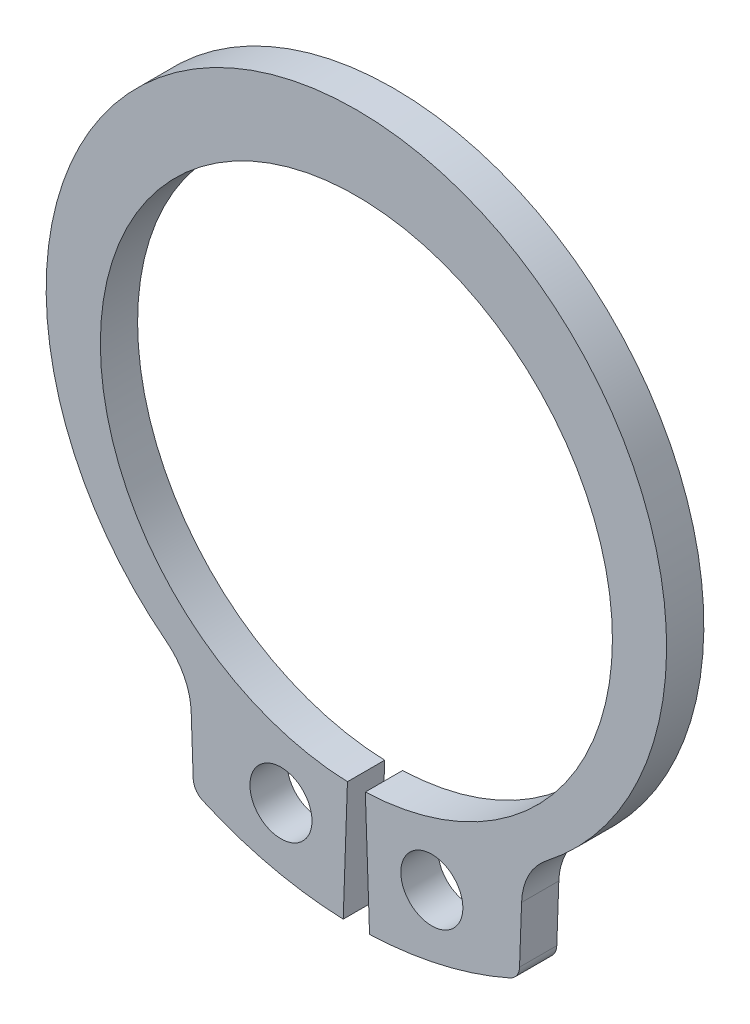
ISO-10303-21;
HEADER;
FILE_DESCRIPTION(('STEP AP214'),'2;1');
FILE_NAME('part.step','',(''),(''),'','','');
FILE_SCHEMA(('AUTOMOTIVE_DESIGN { 1 0 10303 214 1 1 1 1 }'));
ENDSEC;
DATA;
#1=APPLICATION_CONTEXT('core data for automotive mechanical design processes');
#2=APPLICATION_PROTOCOL_DEFINITION('international standard','automotive_design',2000,#1);
#3=PRODUCT_CONTEXT('',#1,'mechanical');
#4=PRODUCT('Part','Part','',(#3));
#5=PRODUCT_RELATED_PRODUCT_CATEGORY('part','',(#4));
#6=PRODUCT_DEFINITION_FORMATION('','',#4);
#7=PRODUCT_DEFINITION_CONTEXT('part definition',#1,'design');
#8=PRODUCT_DEFINITION('design','',#6,#7);
#9=PRODUCT_DEFINITION_SHAPE('','',#8);
#10=(LENGTH_UNIT() NAMED_UNIT(*) SI_UNIT(.MILLI.,.METRE.));
#11=(NAMED_UNIT(*) PLANE_ANGLE_UNIT() SI_UNIT($,.RADIAN.));
#12=(NAMED_UNIT(*) SI_UNIT($,.STERADIAN.) SOLID_ANGLE_UNIT());
#13=UNCERTAINTY_MEASURE_WITH_UNIT(LENGTH_MEASURE(1.E-05),#10,'distance_accuracy_value','');
#14=(GEOMETRIC_REPRESENTATION_CONTEXT(3) GLOBAL_UNCERTAINTY_ASSIGNED_CONTEXT((#13)) GLOBAL_UNIT_ASSIGNED_CONTEXT((#10,
#11,#12)) REPRESENTATION_CONTEXT('',''));
#15=CARTESIAN_POINT('',(0.,0.,0.));
#16=DIRECTION('',(0.,0.,1.));
#17=DIRECTION('',(1.,0.,0.));
#18=AXIS2_PLACEMENT_3D('',#15,#16,#17);
#19=CARTESIAN_POINT('',(0.,0.720406243076457,1.2));
#20=DIRECTION('',(0.,0.,-1.));
#21=DIRECTION('',(-1.,0.,0.));
#22=AXIS2_PLACEMENT_3D('',#19,#20,#21);
#23=PLANE('',#22);
#24=CARTESIAN_POINT('',(0.,0.0661609664452127,1.2));
#25=DIRECTION('',(0.,0.,-1.));
#26=DIRECTION('',(1.,0.,0.));
#27=AXIS2_PLACEMENT_3D('',#24,#25,#26);
#28=CIRCLE('',#27,12.1574059632307);
#29=CARTESIAN_POINT('',(4.94954551195212,-11.0380958290324,1.2));
#30=VERTEX_POINT('',#29);
#31=CARTESIAN_POINT('',(0.42428734932473,-12.0838390335548,1.2));
#32=VERTEX_POINT('',#31);
#33=EDGE_CURVE('E152',#30,#32,#28,.T.);
#34=ORIENTED_EDGE('',*,*,#33,.F.);
#35=CARTESIAN_POINT('',(4.73784215401546,-10.5631414225487,1.2));
#36=DIRECTION('',(0.,0.,-1.));
#37=DIRECTION('',(-1.,0.,0.));
#38=AXIS2_PLACEMENT_3D('',#35,#36,#37);
#39=CIRCLE('',#38,0.52);
#40=CARTESIAN_POINT('',(5.25751518677685,-10.5815788578525,1.2));
#41=VERTEX_POINT('',#40);
#42=EDGE_CURVE('E11',#30,#41,#39,.F.);
#43=ORIENTED_EDGE('',*,*,#42,.T.);
#44=DIRECTION('',(-0.0354566063534277,-0.999371216848823,0.));
#45=VECTOR('',#44,1.);
#46=CARTESIAN_POINT('',(5.24618005318945,-10.9010681550929,1.2));
#47=LINE('',#46,#45);
#48=CARTESIAN_POINT('',(5.32274901921951,-8.74291404435922,1.2));
#49=VERTEX_POINT('',#48);
#50=EDGE_CURVE('E155',#49,#41,#47,.T.);
#51=ORIENTED_EDGE('',*,*,#50,.F.);
#52=CARTESIAN_POINT('',(7.39144743809657,-8.81630921951081,1.2));
#53=DIRECTION('',(0.,0.,-1.));
#54=DIRECTION('',(-1.,0.,0.));
#55=AXIS2_PLACEMENT_3D('',#52,#53,#54);
#56=CIRCLE('',#55,2.07);
#57=CARTESIAN_POINT('',(6.12337125491123,-7.18019101056682,1.2));
#58=VERTEX_POINT('',#57);
#59=EDGE_CURVE('E224',#49,#58,#56,.T.);
#60=ORIENTED_EDGE('',*,*,#59,.T.);
#61=CARTESIAN_POINT('',(0.,0.720406243076457,1.2));
#62=DIRECTION('',(0.,0.,1.));
#63=DIRECTION('',(-1.,0.,0.));
#64=AXIS2_PLACEMENT_3D('',#61,#62,#63);
#65=CIRCLE('',#64,9.99575472336876);
#66=CARTESIAN_POINT('',(-6.12337125491123,-7.18019101056681,1.2));
#67=VERTEX_POINT('',#66);
#68=EDGE_CURVE('E176',#58,#67,#65,.T.);
#69=ORIENTED_EDGE('',*,*,#68,.T.);
#70=CARTESIAN_POINT('',(-7.39144743809657,-8.81630921951081,1.2));
#71=DIRECTION('',(0.,0.,-1.));
#72=DIRECTION('',(-1.,0.,0.));
#73=AXIS2_PLACEMENT_3D('',#70,#71,#72);
#74=CIRCLE('',#73,2.07);
#75=CARTESIAN_POINT('',(-5.32274901921951,-8.74291404435921,1.2));
#76=VERTEX_POINT('',#75);
#77=EDGE_CURVE('E206',#67,#76,#74,.T.);
#78=ORIENTED_EDGE('',*,*,#77,.T.);
#79=DIRECTION('',(0.0354566063534277,-0.999371216848823,0.));
#80=VECTOR('',#79,1.);
#81=CARTESIAN_POINT('',(-5.24618005318945,-10.9010681550929,1.2));
#82=LINE('',#81,#80);
#83=CARTESIAN_POINT('',(-5.25751518677685,-10.5815788578525,1.2));
#84=VERTEX_POINT('',#83);
#85=EDGE_CURVE('E178',#76,#84,#82,.T.);
#86=ORIENTED_EDGE('',*,*,#85,.T.);
#87=CARTESIAN_POINT('',(-4.73784215401546,-10.5631414225487,1.2));
#88=DIRECTION('',(0.,0.,-1.));
#89=DIRECTION('',(-1.,0.,0.));
#90=AXIS2_PLACEMENT_3D('',#87,#88,#89);
#91=CIRCLE('',#90,0.52);
#92=CARTESIAN_POINT('',(-4.94954551195212,-11.0380958290324,1.2));
#93=VERTEX_POINT('',#92);
#94=EDGE_CURVE('E215',#84,#93,#91,.F.);
#95=ORIENTED_EDGE('',*,*,#94,.T.);
#96=CARTESIAN_POINT('',(0.,0.0661609664452127,1.2));
#97=DIRECTION('',(0.,0.,1.));
#98=DIRECTION('',(-1.,0.,0.));
#99=AXIS2_PLACEMENT_3D('',#96,#97,#98);
#100=CIRCLE('',#99,12.1574059632307);
#101=CARTESIAN_POINT('',(-0.42428734932473,-12.0838390335548,1.2));
#102=VERTEX_POINT('',#101);
#103=EDGE_CURVE('E181',#93,#102,#100,.T.);
#104=ORIENTED_EDGE('',*,*,#103,.T.);
#105=DIRECTION('',(0.0348994967025018,0.999390827019096,0.));
#106=VECTOR('',#105,1.);
#107=CARTESIAN_POINT('',(-0.42428734932473,-12.0838390335548,1.2));
#108=LINE('',#107,#106);
#109=CARTESIAN_POINT('',(-0.287920847795629,-8.17881335646233,1.2));
#110=VERTEX_POINT('',#109);
#111=EDGE_CURVE('E132',#102,#110,#108,.T.);
#112=ORIENTED_EDGE('',*,*,#111,.T.);
#113=CARTESIAN_POINT('',(0.,0.0661609664452127,1.2));
#114=DIRECTION('',(0.,0.,-1.));
#115=DIRECTION('',(1.,0.,0.));
#116=AXIS2_PLACEMENT_3D('',#113,#114,#115);
#117=CIRCLE('',#116,8.25);
#118=CARTESIAN_POINT('',(0.287920847795629,-8.17881335646233,1.2));
#119=VERTEX_POINT('',#118);
#120=EDGE_CURVE('E126',#110,#119,#117,.T.);
#121=ORIENTED_EDGE('',*,*,#120,.T.);
#122=DIRECTION('',(-0.0348994967025018,0.999390827019096,0.));
#123=VECTOR('',#122,1.);
#124=CARTESIAN_POINT('',(0.42428734932473,-12.0838390335548,1.2));
#125=LINE('',#124,#123);
#126=EDGE_CURVE('E130',#32,#119,#125,.T.);
#127=ORIENTED_EDGE('',*,*,#126,.F.);
#128=EDGE_LOOP('',(#34,#43,#51,#60,#69,#78,#86,#95,#104,#112,#121,#127));
#129=FACE_BOUND('',#128,.T.);
#130=CARTESIAN_POINT('',(-2.43082406239007,-9.84376582010226,1.2));
#131=DIRECTION('',(0.,0.,1.));
#132=DIRECTION('',(1.,0.,0.));
#133=AXIS2_PLACEMENT_3D('',#130,#131,#132);
#134=CIRCLE('',#133,1.);
#135=CARTESIAN_POINT('',(-1.43082406239007,-9.84376582010226,1.2));
#136=VERTEX_POINT('',#135);
#137=EDGE_CURVE('E170',#136,#136,#134,.T.);
#138=ORIENTED_EDGE('',*,*,#137,.F.);
#139=EDGE_LOOP('',(#138));
#140=FACE_BOUND('',#139,.T.);
#141=CARTESIAN_POINT('',(2.43082406239007,-9.84376582010226,1.2));
#142=DIRECTION('',(0.,0.,-1.));
#143=DIRECTION('',(-1.,0.,0.));
#144=AXIS2_PLACEMENT_3D('',#141,#142,#143);
#145=CIRCLE('',#144,1.);
#146=CARTESIAN_POINT('',(1.43082406239007,-9.84376582010226,1.2));
#147=VERTEX_POINT('',#146);
#148=EDGE_CURVE('E167',#147,#147,#145,.T.);
#149=ORIENTED_EDGE('',*,*,#148,.T.);
#150=EDGE_LOOP('',(#149));
#151=FACE_BOUND('',#150,.T.);
#152=ADVANCED_FACE('F39',(#129,#140,#151),#23,.F.);
#153=CARTESIAN_POINT('',(0.,0.720406243076457,0.));
#154=DIRECTION('',(0.,0.,-1.));
#155=DIRECTION('',(-1.,0.,0.));
#156=AXIS2_PLACEMENT_3D('',#153,#154,#155);
#157=PLANE('',#156);
#158=DIRECTION('',(-0.0354566063534277,-0.999371216848823,0.));
#159=VECTOR('',#158,1.);
#160=CARTESIAN_POINT('',(5.24618005318945,-10.9010681550929,0.));
#161=LINE('',#160,#159);
#162=CARTESIAN_POINT('',(5.32274901921951,-8.74291404435922,0.));
#163=VERTEX_POINT('',#162);
#164=CARTESIAN_POINT('',(5.25751518677685,-10.5815788578525,0.));
#165=VERTEX_POINT('',#164);
#166=EDGE_CURVE('E153',#163,#165,#161,.T.);
#167=ORIENTED_EDGE('',*,*,#166,.T.);
#168=CARTESIAN_POINT('',(4.73784215401546,-10.5631414225487,0.));
#169=DIRECTION('',(0.,0.,-1.));
#170=DIRECTION('',(-1.,0.,0.));
#171=AXIS2_PLACEMENT_3D('',#168,#169,#170);
#172=CIRCLE('',#171,0.52);
#173=CARTESIAN_POINT('',(4.94954551195212,-11.0380958290324,0.));
#174=VERTEX_POINT('',#173);
#175=EDGE_CURVE('E61',#165,#174,#172,.T.);
#176=ORIENTED_EDGE('',*,*,#175,.T.);
#177=CARTESIAN_POINT('',(0.,0.0661609664452127,0.));
#178=DIRECTION('',(0.,0.,-1.));
#179=DIRECTION('',(1.,0.,0.));
#180=AXIS2_PLACEMENT_3D('',#177,#178,#179);
#181=CIRCLE('',#180,12.1574059632307);
#182=CARTESIAN_POINT('',(0.42428734932473,-12.0838390335548,0.));
#183=VERTEX_POINT('',#182);
#184=EDGE_CURVE('E157',#174,#183,#181,.T.);
#185=ORIENTED_EDGE('',*,*,#184,.T.);
#186=DIRECTION('',(-0.0348994967025018,0.999390827019096,0.));
#187=VECTOR('',#186,1.);
#188=CARTESIAN_POINT('',(0.42428734932473,-12.0838390335548,0.));
#189=LINE('',#188,#187);
#190=CARTESIAN_POINT('',(0.287920847795629,-8.17881335646233,0.));
#191=VERTEX_POINT('',#190);
#192=EDGE_CURVE('E165',#183,#191,#189,.T.);
#193=ORIENTED_EDGE('',*,*,#192,.T.);
#194=CARTESIAN_POINT('',(0.,0.0661609664452127,0.));
#195=DIRECTION('',(0.,0.,-1.));
#196=DIRECTION('',(1.,0.,0.));
#197=AXIS2_PLACEMENT_3D('',#194,#195,#196);
#198=CIRCLE('',#197,8.25);
#199=CARTESIAN_POINT('',(-0.287920847795629,-8.17881335646233,0.));
#200=VERTEX_POINT('',#199);
#201=EDGE_CURVE('E142',#200,#191,#198,.T.);
#202=ORIENTED_EDGE('',*,*,#201,.F.);
#203=DIRECTION('',(0.0348994967025018,0.999390827019096,0.));
#204=VECTOR('',#203,1.);
#205=CARTESIAN_POINT('',(-0.42428734932473,-12.0838390335548,0.));
#206=LINE('',#205,#204);
#207=CARTESIAN_POINT('',(-0.42428734932473,-12.0838390335548,0.));
#208=VERTEX_POINT('',#207);
#209=EDGE_CURVE('E190',#208,#200,#206,.T.);
#210=ORIENTED_EDGE('',*,*,#209,.F.);
#211=CARTESIAN_POINT('',(0.,0.0661609664452127,0.));
#212=DIRECTION('',(0.,0.,1.));
#213=DIRECTION('',(-1.,0.,0.));
#214=AXIS2_PLACEMENT_3D('',#211,#212,#213);
#215=CIRCLE('',#214,12.1574059632307);
#216=CARTESIAN_POINT('',(-4.94954551195212,-11.0380958290324,0.));
#217=VERTEX_POINT('',#216);
#218=EDGE_CURVE('E188',#217,#208,#215,.T.);
#219=ORIENTED_EDGE('',*,*,#218,.F.);
#220=CARTESIAN_POINT('',(-4.73784215401546,-10.5631414225487,0.));
#221=DIRECTION('',(0.,0.,-1.));
#222=DIRECTION('',(-1.,0.,0.));
#223=AXIS2_PLACEMENT_3D('',#220,#221,#222);
#224=CIRCLE('',#223,0.52);
#225=CARTESIAN_POINT('',(-5.25751518677685,-10.5815788578525,0.));
#226=VERTEX_POINT('',#225);
#227=EDGE_CURVE('E211',#217,#226,#224,.T.);
#228=ORIENTED_EDGE('',*,*,#227,.T.);
#229=DIRECTION('',(0.0354566063534277,-0.999371216848823,0.));
#230=VECTOR('',#229,1.);
#231=CARTESIAN_POINT('',(-5.24618005318945,-10.9010681550929,0.));
#232=LINE('',#231,#230);
#233=CARTESIAN_POINT('',(-5.32274901921951,-8.74291404435921,0.));
#234=VERTEX_POINT('',#233);
#235=EDGE_CURVE('E185',#234,#226,#232,.T.);
#236=ORIENTED_EDGE('',*,*,#235,.F.);
#237=CARTESIAN_POINT('',(-7.39144743809657,-8.81630921951081,0.));
#238=DIRECTION('',(0.,0.,-1.));
#239=DIRECTION('',(-1.,0.,0.));
#240=AXIS2_PLACEMENT_3D('',#237,#238,#239);
#241=CIRCLE('',#240,2.07);
#242=CARTESIAN_POINT('',(-6.12337125491123,-7.18019101056681,0.));
#243=VERTEX_POINT('',#242);
#244=EDGE_CURVE('E203',#234,#243,#241,.F.);
#245=ORIENTED_EDGE('',*,*,#244,.T.);
#246=CARTESIAN_POINT('',(0.,0.720406243076457,0.));
#247=DIRECTION('',(0.,0.,1.));
#248=DIRECTION('',(-1.,0.,0.));
#249=AXIS2_PLACEMENT_3D('',#246,#247,#248);
#250=CIRCLE('',#249,9.99575472336876);
#251=CARTESIAN_POINT('',(6.12337125491123,-7.18019101056682,0.));
#252=VERTEX_POINT('',#251);
#253=EDGE_CURVE('E173',#252,#243,#250,.T.);
#254=ORIENTED_EDGE('',*,*,#253,.F.);
#255=CARTESIAN_POINT('',(7.39144743809657,-8.81630921951081,0.));
#256=DIRECTION('',(0.,0.,-1.));
#257=DIRECTION('',(-1.,0.,0.));
#258=AXIS2_PLACEMENT_3D('',#255,#256,#257);
#259=CIRCLE('',#258,2.07);
#260=EDGE_CURVE('E222',#252,#163,#259,.F.);
#261=ORIENTED_EDGE('',*,*,#260,.T.);
#262=EDGE_LOOP('',(#167,#176,#185,#193,#202,#210,#219,#228,#236,#245,#254,#261));
#263=FACE_BOUND('',#262,.T.);
#264=CARTESIAN_POINT('',(-2.43082406239007,-9.84376582010226,0.));
#265=DIRECTION('',(0.,0.,1.));
#266=DIRECTION('',(1.,0.,0.));
#267=AXIS2_PLACEMENT_3D('',#264,#265,#266);
#268=CIRCLE('',#267,1.);
#269=CARTESIAN_POINT('',(-1.43082406239007,-9.84376582010226,0.));
#270=VERTEX_POINT('',#269);
#271=EDGE_CURVE('E146',#270,#270,#268,.T.);
#272=ORIENTED_EDGE('',*,*,#271,.T.);
#273=EDGE_LOOP('',(#272));
#274=FACE_BOUND('',#273,.T.);
#275=CARTESIAN_POINT('',(2.43082406239007,-9.84376582010226,0.));
#276=DIRECTION('',(0.,0.,-1.));
#277=DIRECTION('',(-1.,0.,0.));
#278=AXIS2_PLACEMENT_3D('',#275,#276,#277);
#279=CIRCLE('',#278,1.);
#280=CARTESIAN_POINT('',(1.43082406239007,-9.84376582010226,0.));
#281=VERTEX_POINT('',#280);
#282=EDGE_CURVE('E160',#281,#281,#279,.T.);
#283=ORIENTED_EDGE('',*,*,#282,.F.);
#284=EDGE_LOOP('',(#283));
#285=FACE_BOUND('',#284,.T.);
#286=ADVANCED_FACE('F237',(#263,#274,#285),#157,.T.);
#287=CARTESIAN_POINT('',(0.,0.720406243076457,1.2));
#288=DIRECTION('',(0.,0.,-1.));
#289=DIRECTION('',(-1.,0.,0.));
#290=AXIS2_PLACEMENT_3D('',#287,#288,#289);
#291=CYLINDRICAL_SURFACE('',#290,9.99575472336876);
#292=ORIENTED_EDGE('',*,*,#68,.F.);
#293=DIRECTION('',(0.,0.,-1.));
#294=VECTOR('',#293,1.);
#295=CARTESIAN_POINT('',(6.12337125491123,-7.18019101056682,1.2));
#296=LINE('',#295,#294);
#297=EDGE_CURVE('E217',#58,#252,#296,.T.);
#298=ORIENTED_EDGE('',*,*,#297,.T.);
#299=ORIENTED_EDGE('',*,*,#253,.T.);
#300=DIRECTION('',(0.,0.,-1.));
#301=VECTOR('',#300,1.);
#302=CARTESIAN_POINT('',(-6.12337125491123,-7.18019101056681,1.2));
#303=LINE('',#302,#301);
#304=EDGE_CURVE('E200',#243,#67,#303,.F.);
#305=ORIENTED_EDGE('',*,*,#304,.T.);
#306=EDGE_LOOP('',(#292,#298,#299,#305));
#307=FACE_BOUND('',#306,.T.);
#308=ADVANCED_FACE('F246',(#307),#291,.T.);
#309=CARTESIAN_POINT('',(-5.24618005318945,-10.9010681550929,1.2));
#310=DIRECTION('',(0.999371216848823,0.0354566063534277,0.));
#311=DIRECTION('',(-0.0354566063534277,0.999371216848823,0.));
#312=AXIS2_PLACEMENT_3D('',#309,#310,#311);
#313=PLANE('',#312);
#314=ORIENTED_EDGE('',*,*,#235,.T.);
#315=DIRECTION('',(0.,0.,-1.));
#316=VECTOR('',#315,1.);
#317=CARTESIAN_POINT('',(-5.25751518677685,-10.5815788578525,1.2));
#318=LINE('',#317,#316);
#319=EDGE_CURVE('E213',#226,#84,#318,.F.);
#320=ORIENTED_EDGE('',*,*,#319,.T.);
#321=ORIENTED_EDGE('',*,*,#85,.F.);
#322=DIRECTION('',(0.,0.,1.));
#323=VECTOR('',#322,1.);
#324=CARTESIAN_POINT('',(-5.32274901921951,-8.74291404435921,0.));
#325=LINE('',#324,#323);
#326=EDGE_CURVE('E197',#76,#234,#325,.F.);
#327=ORIENTED_EDGE('',*,*,#326,.T.);
#328=EDGE_LOOP('',(#314,#320,#321,#327));
#329=FACE_BOUND('',#328,.T.);
#330=ADVANCED_FACE('F275',(#329),#313,.F.);
#331=CARTESIAN_POINT('',(0.,0.0661609664452127,1.2));
#332=DIRECTION('',(0.,0.,-1.));
#333=DIRECTION('',(-1.,0.,0.));
#334=AXIS2_PLACEMENT_3D('',#331,#332,#333);
#335=CYLINDRICAL_SURFACE('',#334,12.1574059632307);
#336=ORIENTED_EDGE('',*,*,#103,.F.);
#337=DIRECTION('',(0.,0.,-1.));
#338=VECTOR('',#337,1.);
#339=CARTESIAN_POINT('',(-4.94954551195212,-11.0380958290324,1.2));
#340=LINE('',#339,#338);
#341=EDGE_CURVE('E208',#93,#217,#340,.T.);
#342=ORIENTED_EDGE('',*,*,#341,.T.);
#343=ORIENTED_EDGE('',*,*,#218,.T.);
#344=DIRECTION('',(0.,0.,-1.));
#345=VECTOR('',#344,1.);
#346=CARTESIAN_POINT('',(-0.42428734932473,-12.0838390335548,1.2));
#347=LINE('',#346,#345);
#348=EDGE_CURVE('E194',#102,#208,#347,.T.);
#349=ORIENTED_EDGE('',*,*,#348,.F.);
#350=EDGE_LOOP('',(#336,#342,#343,#349));
#351=FACE_BOUND('',#350,.T.);
#352=ADVANCED_FACE('F271',(#351),#335,.T.);
#353=CARTESIAN_POINT('',(-0.42428734932473,-12.0838390335548,1.2));
#354=DIRECTION('',(-0.999390827019096,0.0348994967025018,0.));
#355=DIRECTION('',(-0.0348994967025018,-0.999390827019096,0.));
#356=AXIS2_PLACEMENT_3D('',#353,#354,#355);
#357=PLANE('',#356);
#358=ORIENTED_EDGE('',*,*,#209,.T.);
#359=DIRECTION('',(0.,0.,-1.));
#360=VECTOR('',#359,1.);
#361=CARTESIAN_POINT('',(-0.287920847795629,-8.17881335646233,1.2));
#362=LINE('',#361,#360);
#363=EDGE_CURVE('E136',#110,#200,#362,.T.);
#364=ORIENTED_EDGE('',*,*,#363,.F.);
#365=ORIENTED_EDGE('',*,*,#111,.F.);
#366=ORIENTED_EDGE('',*,*,#348,.T.);
#367=EDGE_LOOP('',(#358,#364,#365,#366));
#368=FACE_BOUND('',#367,.T.);
#369=ADVANCED_FACE('F268',(#368),#357,.F.);
#370=CARTESIAN_POINT('',(0.,0.0661609664452127,1.2));
#371=DIRECTION('',(0.,0.,-1.));
#372=DIRECTION('',(-1.,0.,0.));
#373=AXIS2_PLACEMENT_3D('',#370,#371,#372);
#374=CYLINDRICAL_SURFACE('',#373,8.25);
#375=ORIENTED_EDGE('',*,*,#201,.T.);
#376=DIRECTION('',(0.,0.,-1.));
#377=VECTOR('',#376,1.);
#378=CARTESIAN_POINT('',(0.287920847795629,-8.17881335646233,1.2));
#379=LINE('',#378,#377);
#380=EDGE_CURVE('E139',#119,#191,#379,.T.);
#381=ORIENTED_EDGE('',*,*,#380,.F.);
#382=ORIENTED_EDGE('',*,*,#120,.F.);
#383=ORIENTED_EDGE('',*,*,#363,.T.);
#384=EDGE_LOOP('',(#375,#381,#382,#383));
#385=FACE_BOUND('',#384,.T.);
#386=ADVANCED_FACE('F140',(#385),#374,.F.);
#387=CARTESIAN_POINT('',(-2.43082406239007,-9.84376582010226,1.2));
#388=DIRECTION('',(0.,0.,-1.));
#389=DIRECTION('',(-1.,0.,0.));
#390=AXIS2_PLACEMENT_3D('',#387,#388,#389);
#391=CYLINDRICAL_SURFACE('',#390,1.);
#392=ORIENTED_EDGE('',*,*,#137,.T.);
#393=EDGE_LOOP('',(#392));
#394=FACE_BOUND('',#393,.T.);
#395=ORIENTED_EDGE('',*,*,#271,.F.);
#396=EDGE_LOOP('',(#395));
#397=FACE_BOUND('',#396,.T.);
#398=ADVANCED_FACE('F263',(#394,#397),#391,.F.);
#399=CARTESIAN_POINT('',(-7.39144743809657,-8.81630921951081,1.2));
#400=DIRECTION('',(0.,0.,-1.));
#401=DIRECTION('',(-1.,0.,0.));
#402=AXIS2_PLACEMENT_3D('',#399,#400,#401);
#403=CYLINDRICAL_SURFACE('',#402,2.07);
#404=ORIENTED_EDGE('',*,*,#77,.F.);
#405=ORIENTED_EDGE('',*,*,#304,.F.);
#406=ORIENTED_EDGE('',*,*,#244,.F.);
#407=ORIENTED_EDGE('',*,*,#326,.F.);
#408=EDGE_LOOP('',(#404,#405,#406,#407));
#409=FACE_BOUND('',#408,.T.);
#410=ADVANCED_FACE('F282',(#409),#403,.F.);
#411=CARTESIAN_POINT('',(-4.73784215401546,-10.5631414225487,1.2));
#412=DIRECTION('',(0.,0.,-1.));
#413=DIRECTION('',(-1.,0.,0.));
#414=AXIS2_PLACEMENT_3D('',#411,#412,#413);
#415=CYLINDRICAL_SURFACE('',#414,0.52);
#416=ORIENTED_EDGE('',*,*,#94,.F.);
#417=ORIENTED_EDGE('',*,*,#319,.F.);
#418=ORIENTED_EDGE('',*,*,#227,.F.);
#419=ORIENTED_EDGE('',*,*,#341,.F.);
#420=EDGE_LOOP('',(#416,#417,#418,#419));
#421=FACE_BOUND('',#420,.T.);
#422=ADVANCED_FACE('F285',(#421),#415,.T.);
#423=CARTESIAN_POINT('',(0.42428734932473,-12.0838390335548,1.2));
#424=DIRECTION('',(-0.999390827019096,-0.0348994967025018,0.));
#425=DIRECTION('',(0.0348994967025018,-0.999390827019096,0.));
#426=AXIS2_PLACEMENT_3D('',#423,#424,#425);
#427=PLANE('',#426);
#428=ORIENTED_EDGE('',*,*,#192,.F.);
#429=DIRECTION('',(0.,0.,-1.));
#430=VECTOR('',#429,1.);
#431=CARTESIAN_POINT('',(0.42428734932473,-12.0838390335548,1.2));
#432=LINE('',#431,#430);
#433=EDGE_CURVE('E147',#32,#183,#432,.T.);
#434=ORIENTED_EDGE('',*,*,#433,.F.);
#435=ORIENTED_EDGE('',*,*,#126,.T.);
#436=ORIENTED_EDGE('',*,*,#380,.T.);
#437=EDGE_LOOP('',(#428,#434,#435,#436));
#438=FACE_BOUND('',#437,.T.);
#439=ADVANCED_FACE('F150',(#438),#427,.T.);
#440=CARTESIAN_POINT('',(0.,0.0661609664452127,1.2));
#441=DIRECTION('',(0.,0.,-1.));
#442=DIRECTION('',(-1.,0.,0.));
#443=AXIS2_PLACEMENT_3D('',#440,#441,#442);
#444=CYLINDRICAL_SURFACE('',#443,12.1574059632307);
#445=ORIENTED_EDGE('',*,*,#184,.F.);
#446=DIRECTION('',(0.,0.,-1.));
#447=VECTOR('',#446,1.);
#448=CARTESIAN_POINT('',(4.94954551195212,-11.0380958290324,1.2));
#449=LINE('',#448,#447);
#450=EDGE_CURVE('E47',#174,#30,#449,.F.);
#451=ORIENTED_EDGE('',*,*,#450,.T.);
#452=ORIENTED_EDGE('',*,*,#33,.T.);
#453=ORIENTED_EDGE('',*,*,#433,.T.);
#454=EDGE_LOOP('',(#445,#451,#452,#453));
#455=FACE_BOUND('',#454,.T.);
#456=ADVANCED_FACE('F291',(#455),#444,.T.);
#457=CARTESIAN_POINT('',(5.24618005318945,-10.9010681550929,1.2));
#458=DIRECTION('',(0.999371216848823,-0.0354566063534277,0.));
#459=DIRECTION('',(0.0354566063534277,0.999371216848823,0.));
#460=AXIS2_PLACEMENT_3D('',#457,#458,#459);
#461=PLANE('',#460);
#462=ORIENTED_EDGE('',*,*,#50,.T.);
#463=DIRECTION('',(0.,0.,-1.));
#464=VECTOR('',#463,1.);
#465=CARTESIAN_POINT('',(5.25751518677685,-10.5815788578525,1.2));
#466=LINE('',#465,#464);
#467=EDGE_CURVE('E226',#41,#165,#466,.T.);
#468=ORIENTED_EDGE('',*,*,#467,.T.);
#469=ORIENTED_EDGE('',*,*,#166,.F.);
#470=DIRECTION('',(0.,0.,-1.));
#471=VECTOR('',#470,1.);
#472=CARTESIAN_POINT('',(5.32274901921951,-8.74291404435922,1.2));
#473=LINE('',#472,#471);
#474=EDGE_CURVE('E220',#163,#49,#473,.F.);
#475=ORIENTED_EDGE('',*,*,#474,.T.);
#476=EDGE_LOOP('',(#462,#468,#469,#475));
#477=FACE_BOUND('',#476,.T.);
#478=ADVANCED_FACE('F232',(#477),#461,.T.);
#479=CARTESIAN_POINT('',(2.43082406239007,-9.84376582010226,1.2));
#480=DIRECTION('',(0.,0.,-1.));
#481=DIRECTION('',(-1.,0.,0.));
#482=AXIS2_PLACEMENT_3D('',#479,#480,#481);
#483=CYLINDRICAL_SURFACE('',#482,1.);
#484=ORIENTED_EDGE('',*,*,#148,.F.);
#485=EDGE_LOOP('',(#484));
#486=FACE_BOUND('',#485,.T.);
#487=ORIENTED_EDGE('',*,*,#282,.T.);
#488=EDGE_LOOP('',(#487));
#489=FACE_BOUND('',#488,.T.);
#490=ADVANCED_FACE('F254',(#486,#489),#483,.F.);
#491=CARTESIAN_POINT('',(7.39144743809657,-8.81630921951081,1.2));
#492=DIRECTION('',(0.,0.,-1.));
#493=DIRECTION('',(-1.,0.,0.));
#494=AXIS2_PLACEMENT_3D('',#491,#492,#493);
#495=CYLINDRICAL_SURFACE('',#494,2.07);
#496=ORIENTED_EDGE('',*,*,#59,.F.);
#497=ORIENTED_EDGE('',*,*,#474,.F.);
#498=ORIENTED_EDGE('',*,*,#260,.F.);
#499=ORIENTED_EDGE('',*,*,#297,.F.);
#500=EDGE_LOOP('',(#496,#497,#498,#499));
#501=FACE_BOUND('',#500,.T.);
#502=ADVANCED_FACE('F243',(#501),#495,.F.);
#503=CARTESIAN_POINT('',(4.73784215401546,-10.5631414225487,1.2));
#504=DIRECTION('',(0.,0.,-1.));
#505=DIRECTION('',(-1.,0.,0.));
#506=AXIS2_PLACEMENT_3D('',#503,#504,#505);
#507=CYLINDRICAL_SURFACE('',#506,0.52);
#508=ORIENTED_EDGE('',*,*,#42,.F.);
#509=ORIENTED_EDGE('',*,*,#450,.F.);
#510=ORIENTED_EDGE('',*,*,#175,.F.);
#511=ORIENTED_EDGE('',*,*,#467,.F.);
#512=EDGE_LOOP('',(#508,#509,#510,#511));
#513=FACE_BOUND('',#512,.T.);
#514=ADVANCED_FACE('F41',(#513),#507,.T.);
#515=CLOSED_SHELL('',(#152,#286,#308,#330,#352,#369,#386,#398,#410,#422,#439,#456,#478,#490,
#502,#514));
#516=MANIFOLD_SOLID_BREP('B2',#515);
#517=ADVANCED_BREP_SHAPE_REPRESENTATION('',(#18,#516),#14);
#518=SHAPE_DEFINITION_REPRESENTATION(#9,#517);
ENDSEC;
END-ISO-10303-21;
